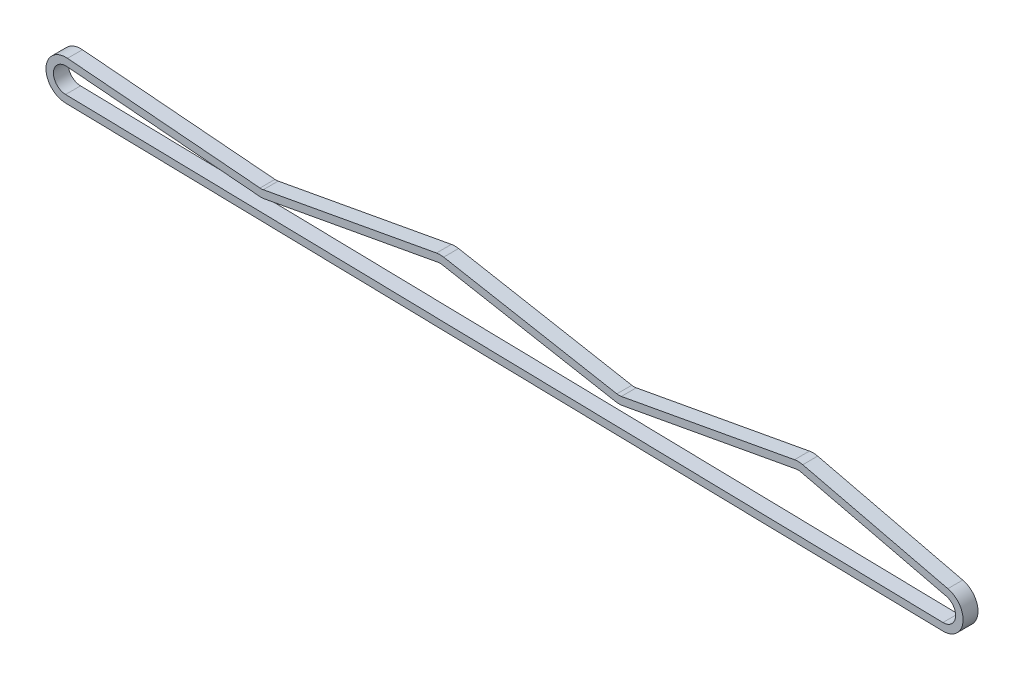
ISO-10303-21;
HEADER;
FILE_DESCRIPTION(('STEP AP214'),'2;1');
FILE_NAME('part.step','',(''),(''),'','','');
FILE_SCHEMA(('AUTOMOTIVE_DESIGN { 1 0 10303 214 1 1 1 1 }'));
ENDSEC;
DATA;
#1=APPLICATION_CONTEXT('core data for automotive mechanical design processes');
#2=APPLICATION_PROTOCOL_DEFINITION('international standard','automotive_design',2000,#1);
#3=PRODUCT_CONTEXT('',#1,'mechanical');
#4=PRODUCT('Part','Part','',(#3));
#5=PRODUCT_RELATED_PRODUCT_CATEGORY('part','',(#4));
#6=PRODUCT_DEFINITION_FORMATION('','',#4);
#7=PRODUCT_DEFINITION_CONTEXT('part definition',#1,'design');
#8=PRODUCT_DEFINITION('design','',#6,#7);
#9=PRODUCT_DEFINITION_SHAPE('','',#8);
#10=(LENGTH_UNIT() NAMED_UNIT(*) SI_UNIT(.MILLI.,.METRE.));
#11=(NAMED_UNIT(*) PLANE_ANGLE_UNIT() SI_UNIT($,.RADIAN.));
#12=(NAMED_UNIT(*) SI_UNIT($,.STERADIAN.) SOLID_ANGLE_UNIT());
#13=UNCERTAINTY_MEASURE_WITH_UNIT(LENGTH_MEASURE(1.E-05),#10,'distance_accuracy_value','');
#14=(GEOMETRIC_REPRESENTATION_CONTEXT(3) GLOBAL_UNCERTAINTY_ASSIGNED_CONTEXT((#13)) GLOBAL_UNIT_ASSIGNED_CONTEXT((#10,
#11,#12)) REPRESENTATION_CONTEXT('',''));
#15=CARTESIAN_POINT('',(0.,0.,0.));
#16=DIRECTION('',(0.,0.,1.));
#17=DIRECTION('',(1.,0.,0.));
#18=AXIS2_PLACEMENT_3D('',#15,#16,#17);
#19=CARTESIAN_POINT('',(157.37190429163,-5.00000000000004,3.));
#20=DIRECTION('',(0.,0.,-1.));
#21=DIRECTION('',(-1.,0.,0.));
#22=AXIS2_PLACEMENT_3D('',#19,#20,#21);
#23=PLANE('',#22);
#24=CARTESIAN_POINT('',(157.37190429163,-5.00000000000004,3.));
#25=DIRECTION('',(0.,0.,1.));
#26=DIRECTION('',(-1.,0.,0.));
#27=AXIS2_PLACEMENT_3D('',#24,#25,#26);
#28=CIRCLE('',#27,8.00000000000001);
#29=CARTESIAN_POINT('',(157.201895781407,-12.9981933651577,3.));
#30=VERTEX_POINT('',#29);
#31=CARTESIAN_POINT('',(159.238570958296,2.77917447776788,3.));
#32=VERTEX_POINT('',#31);
#33=EDGE_CURVE('E291',#30,#32,#28,.T.);
#34=ORIENTED_EDGE('',*,*,#33,.T.);
#35=DIRECTION('',(-0.972396809720988,0.233333333333333,0.));
#36=VECTOR('',#35,1.);
#37=CARTESIAN_POINT('',(100.894762375037,16.7791744777679,3.));
#38=LINE('',#37,#36);
#39=CARTESIAN_POINT('',(100.894762375037,16.7791744777679,3.));
#40=VERTEX_POINT('',#39);
#41=EDGE_CURVE('E294',#32,#40,#38,.T.);
#42=ORIENTED_EDGE('',*,*,#41,.T.);
#43=CARTESIAN_POINT('',(99.0280957083704,8.99999999999997,3.));
#44=DIRECTION('',(0.,0.,1.));
#45=DIRECTION('',(-1.,0.,0.));
#46=AXIS2_PLACEMENT_3D('',#43,#44,#45);
#47=CIRCLE('',#46,8.00000000000001);
#48=CARTESIAN_POINT('',(97.583651263926,16.8685183006023,3.));
#49=VERTEX_POINT('',#48);
#50=EDGE_CURVE('E297',#40,#49,#47,.T.);
#51=ORIENTED_EDGE('',*,*,#50,.T.);
#52=DIRECTION('',(-0.98356478757529,-0.180555555555555,0.));
#53=VECTOR('',#52,1.);
#54=CARTESIAN_POINT('',(27.930873486149,4.08217606212373,3.));
#55=LINE('',#54,#53);
#56=CARTESIAN_POINT('',(27.930873486149,4.08217606212373,3.));
#57=VERTEX_POINT('',#56);
#58=EDGE_CURVE('E299',#49,#57,#55,.T.);
#59=ORIENTED_EDGE('',*,*,#58,.T.);
#60=CARTESIAN_POINT('',(27.0280957083703,9.00000000000001,3.));
#61=DIRECTION('',(0.,0.,-1.));
#62=DIRECTION('',(1.,0.,0.));
#63=AXIS2_PLACEMENT_3D('',#60,#61,#62);
#64=CIRCLE('',#63,5.);
#65=CARTESIAN_POINT('',(26.1253179305915,4.08217606212374,3.));
#66=VERTEX_POINT('',#65);
#67=EDGE_CURVE('E301',#57,#66,#64,.T.);
#68=ORIENTED_EDGE('',*,*,#67,.T.);
#69=DIRECTION('',(-0.98356478757529,0.180555555555555,0.));
#70=VECTOR('',#69,1.);
#71=CARTESIAN_POINT('',(-43.5274598471853,16.8685183006023,3.));
#72=LINE('',#71,#70);
#73=CARTESIAN_POINT('',(-43.5274598471853,16.8685183006023,3.));
#74=VERTEX_POINT('',#73);
#75=EDGE_CURVE('E303',#66,#74,#72,.T.);
#76=ORIENTED_EDGE('',*,*,#75,.T.);
#77=CARTESIAN_POINT('',(-44.9719042916297,8.99999999999997,3.));
#78=DIRECTION('',(0.,0.,1.));
#79=DIRECTION('',(-1.,0.,0.));
#80=AXIS2_PLACEMENT_3D('',#77,#78,#79);
#81=CIRCLE('',#80,8.00000000000001);
#82=CARTESIAN_POINT('',(-46.4163487360742,16.8685183006023,3.));
#83=VERTEX_POINT('',#82);
#84=EDGE_CURVE('E305',#74,#83,#81,.T.);
#85=ORIENTED_EDGE('',*,*,#84,.T.);
#86=DIRECTION('',(-0.983564787575294,-0.180555555555535,0.));
#87=VECTOR('',#86,1.);
#88=CARTESIAN_POINT('',(-116.069126513851,4.0821760621252,3.));
#89=LINE('',#88,#87);
#90=CARTESIAN_POINT('',(-116.069126513851,4.0821760621252,3.));
#91=VERTEX_POINT('',#90);
#92=EDGE_CURVE('E307',#83,#91,#89,.T.);
#93=ORIENTED_EDGE('',*,*,#92,.T.);
#94=CARTESIAN_POINT('',(-116.97190429163,9.0000000000015,3.));
#95=DIRECTION('',(0.,0.,-1.));
#96=DIRECTION('',(1.,0.,0.));
#97=AXIS2_PLACEMENT_3D('',#94,#95,#96);
#98=CIRCLE('',#97,5.);
#99=CARTESIAN_POINT('',(-117.387348627879,4.01728929161408,3.));
#100=VERTEX_POINT('',#99);
#101=EDGE_CURVE('E309',#91,#100,#98,.T.);
#102=ORIENTED_EDGE('',*,*,#101,.T.);
#103=DIRECTION('',(-0.996542141677499,0.083088867249614,0.));
#104=VECTOR('',#103,1.);
#105=CARTESIAN_POINT('',(-194.807193353633,10.4723371334199,3.));
#106=LINE('',#105,#104);
#107=CARTESIAN_POINT('',(-194.807193353633,10.4723371334199,3.));
#108=VERTEX_POINT('',#107);
#109=EDGE_CURVE('E311',#100,#108,#106,.T.);
#110=ORIENTED_EDGE('',*,*,#109,.T.);
#111=CARTESIAN_POINT('',(-195.47190429163,2.49999999999992,3.));
#112=DIRECTION('',(0.,0.,1.));
#113=DIRECTION('',(1.,0.,0.));
#114=AXIS2_PLACEMENT_3D('',#111,#112,#113);
#115=CIRCLE('',#114,8.00000000000001);
#116=CARTESIAN_POINT('',(-195.641912801853,-5.49819336515773,3.));
#117=VERTEX_POINT('',#116);
#118=EDGE_CURVE('E313',#108,#117,#115,.T.);
#119=ORIENTED_EDGE('',*,*,#118,.T.);
#120=DIRECTION('',(0.999774170644705,-0.0212510637778866,0.));
#121=VECTOR('',#120,1.);
#122=CARTESIAN_POINT('',(157.201895781407,-12.9981933651577,3.));
#123=LINE('',#122,#121);
#124=EDGE_CURVE('E315',#117,#30,#123,.T.);
#125=ORIENTED_EDGE('',*,*,#124,.T.);
#126=EDGE_LOOP('',(#34,#42,#51,#59,#68,#76,#85,#93,#102,#110,#119,#125));
#127=FACE_BOUND('',#126,.T.);
#128=CARTESIAN_POINT('',(-195.47190429163,2.49999999999992,3.));
#129=DIRECTION('',(0.,0.,1.));
#130=DIRECTION('',(1.,0.,0.));
#131=AXIS2_PLACEMENT_3D('',#128,#129,#130);
#132=CIRCLE('',#131,5.00000000000001);
#133=CARTESIAN_POINT('',(-195.056459955382,7.48271070838742,3.));
#134=VERTEX_POINT('',#133);
#135=CARTESIAN_POINT('',(-195.578159610519,-2.49887085322361,3.));
#136=VERTEX_POINT('',#135);
#137=EDGE_CURVE('E198',#134,#136,#132,.T.);
#138=ORIENTED_EDGE('',*,*,#137,.F.);
#139=DIRECTION('',(-0.996542141677499,0.083088867249614,0.));
#140=VECTOR('',#139,1.);
#141=CARTESIAN_POINT('',(-195.056459955382,7.48271070838742,3.));
#142=LINE('',#141,#140);
#143=CARTESIAN_POINT('',(-117.636615229628,1.02766286658163,3.));
#144=VERTEX_POINT('',#143);
#145=EDGE_CURVE('E239',#144,#134,#142,.T.);
#146=ORIENTED_EDGE('',*,*,#145,.F.);
#147=CARTESIAN_POINT('',(-116.97190429163,9.00000000000004,3.));
#148=DIRECTION('',(0.,0.,-1.));
#149=DIRECTION('',(1.,0.,0.));
#150=AXIS2_PLACEMENT_3D('',#147,#148,#149);
#151=CIRCLE('',#150,7.99999999999856);
#152=CARTESIAN_POINT('',(-115.527459847184,1.13148169939943,3.));
#153=VERTEX_POINT('',#152);
#154=EDGE_CURVE('E237',#153,#144,#151,.T.);
#155=ORIENTED_EDGE('',*,*,#154,.F.);
#156=DIRECTION('',(-0.983564787575293,-0.180555555555535,0.));
#157=VECTOR('',#156,1.);
#158=CARTESIAN_POINT('',(-115.527459847184,1.13148169939942,3.));
#159=LINE('',#158,#157);
#160=CARTESIAN_POINT('',(-45.8746820694075,13.9178239378764,3.));
#161=VERTEX_POINT('',#160);
#162=EDGE_CURVE('E235',#161,#153,#159,.T.);
#163=ORIENTED_EDGE('',*,*,#162,.F.);
#164=CARTESIAN_POINT('',(-44.9719042916297,8.99999999999997,3.));
#165=DIRECTION('',(0.,0.,1.));
#166=DIRECTION('',(-1.,0.,0.));
#167=AXIS2_PLACEMENT_3D('',#164,#165,#166);
#168=CIRCLE('',#167,5.);
#169=CARTESIAN_POINT('',(-44.0691265138519,13.9178239378764,3.));
#170=VERTEX_POINT('',#169);
#171=EDGE_CURVE('E233',#170,#161,#168,.T.);
#172=ORIENTED_EDGE('',*,*,#171,.F.);
#173=DIRECTION('',(-0.98356478757529,0.180555555555555,0.));
#174=VECTOR('',#173,1.);
#175=CARTESIAN_POINT('',(-44.0691265138519,13.9178239378764,3.));
#176=LINE('',#175,#174);
#177=CARTESIAN_POINT('',(25.5836512639243,1.13148169939796,3.));
#178=VERTEX_POINT('',#177);
#179=EDGE_CURVE('E231',#178,#170,#176,.T.);
#180=ORIENTED_EDGE('',*,*,#179,.F.);
#181=CARTESIAN_POINT('',(27.0280957083702,9.00000000000001,3.));
#182=DIRECTION('',(0.,0.,-1.));
#183=DIRECTION('',(1.,0.,0.));
#184=AXIS2_PLACEMENT_3D('',#181,#182,#183);
#185=CIRCLE('',#184,8.);
#186=CARTESIAN_POINT('',(28.4725401528162,1.13148169939797,3.));
#187=VERTEX_POINT('',#186);
#188=EDGE_CURVE('E229',#187,#178,#185,.T.);
#189=ORIENTED_EDGE('',*,*,#188,.F.);
#190=DIRECTION('',(-0.98356478757529,-0.180555555555555,0.));
#191=VECTOR('',#190,1.);
#192=CARTESIAN_POINT('',(28.4725401528162,1.13148169939797,3.));
#193=LINE('',#192,#191);
#194=CARTESIAN_POINT('',(98.1253179305927,13.9178239378764,3.));
#195=VERTEX_POINT('',#194);
#196=EDGE_CURVE('E227',#195,#187,#193,.T.);
#197=ORIENTED_EDGE('',*,*,#196,.F.);
#198=CARTESIAN_POINT('',(99.0280957083704,8.99999999999997,3.));
#199=DIRECTION('',(0.,0.,1.));
#200=DIRECTION('',(-1.,0.,0.));
#201=AXIS2_PLACEMENT_3D('',#198,#199,#200);
#202=CIRCLE('',#201,5.);
#203=CARTESIAN_POINT('',(100.194762375037,13.8619840486049,3.));
#204=VERTEX_POINT('',#203);
#205=EDGE_CURVE('E225',#204,#195,#202,.T.);
#206=ORIENTED_EDGE('',*,*,#205,.F.);
#207=DIRECTION('',(-0.972396809720988,0.233333333333333,0.));
#208=VECTOR('',#207,1.);
#209=CARTESIAN_POINT('',(100.194762375037,13.8619840486049,3.));
#210=LINE('',#209,#208);
#211=CARTESIAN_POINT('',(158.538570958296,-0.138015951395092,3.));
#212=VERTEX_POINT('',#211);
#213=EDGE_CURVE('E221',#212,#204,#210,.T.);
#214=ORIENTED_EDGE('',*,*,#213,.F.);
#215=CARTESIAN_POINT('',(157.37190429163,-5.00000000000004,3.));
#216=DIRECTION('',(0.,0.,1.));
#217=DIRECTION('',(-1.,0.,0.));
#218=AXIS2_PLACEMENT_3D('',#215,#216,#217);
#219=CIRCLE('',#218,5.);
#220=CARTESIAN_POINT('',(157.26564897274,-9.99887085322356,3.));
#221=VERTEX_POINT('',#220);
#222=EDGE_CURVE('E219',#221,#212,#219,.T.);
#223=ORIENTED_EDGE('',*,*,#222,.F.);
#224=DIRECTION('',(0.999774170644705,-0.0212510637778866,0.));
#225=VECTOR('',#224,1.);
#226=CARTESIAN_POINT('',(157.26564897274,-9.99887085322356,3.));
#227=LINE('',#226,#225);
#228=EDGE_CURVE('E206',#136,#221,#227,.T.);
#229=ORIENTED_EDGE('',*,*,#228,.F.);
#230=EDGE_LOOP('',(#138,#146,#155,#163,#172,#180,#189,#197,#206,#214,#223,#229));
#231=FACE_BOUND('',#230,.T.);
#232=ADVANCED_FACE('F37',(#127,#231),#23,.F.);
#233=CARTESIAN_POINT('',(157.37190429163,-5.00000000000004,-3.));
#234=DIRECTION('',(0.,0.,-1.));
#235=DIRECTION('',(-1.,0.,0.));
#236=AXIS2_PLACEMENT_3D('',#233,#234,#235);
#237=PLANE('',#236);
#238=CARTESIAN_POINT('',(157.37190429163,-5.00000000000004,-3.));
#239=DIRECTION('',(0.,0.,1.));
#240=DIRECTION('',(-1.,0.,0.));
#241=AXIS2_PLACEMENT_3D('',#238,#239,#240);
#242=CIRCLE('',#241,8.00000000000001);
#243=CARTESIAN_POINT('',(157.201895781407,-12.9981933651577,-3.));
#244=VERTEX_POINT('',#243);
#245=CARTESIAN_POINT('',(159.238570958296,2.77917447776788,-3.));
#246=VERTEX_POINT('',#245);
#247=EDGE_CURVE('E214',#244,#246,#242,.T.);
#248=ORIENTED_EDGE('',*,*,#247,.F.);
#249=DIRECTION('',(0.999774170644705,-0.0212510637778866,0.));
#250=VECTOR('',#249,1.);
#251=CARTESIAN_POINT('',(157.201895781407,-12.9981933651577,-3.));
#252=LINE('',#251,#250);
#253=CARTESIAN_POINT('',(-195.641912801853,-5.49819336515773,-3.));
#254=VERTEX_POINT('',#253);
#255=EDGE_CURVE('E295',#254,#244,#252,.T.);
#256=ORIENTED_EDGE('',*,*,#255,.F.);
#257=CARTESIAN_POINT('',(-195.47190429163,2.49999999999992,-3.));
#258=DIRECTION('',(0.,0.,1.));
#259=DIRECTION('',(1.,0.,0.));
#260=AXIS2_PLACEMENT_3D('',#257,#258,#259);
#261=CIRCLE('',#260,8.00000000000001);
#262=CARTESIAN_POINT('',(-194.807193353633,10.4723371334199,-3.));
#263=VERTEX_POINT('',#262);
#264=EDGE_CURVE('E338',#263,#254,#261,.T.);
#265=ORIENTED_EDGE('',*,*,#264,.F.);
#266=DIRECTION('',(-0.996542141677499,0.083088867249614,0.));
#267=VECTOR('',#266,1.);
#268=CARTESIAN_POINT('',(-194.807193353633,10.4723371334199,-3.));
#269=LINE('',#268,#267);
#270=CARTESIAN_POINT('',(-117.387348627879,4.01728929161408,-3.));
#271=VERTEX_POINT('',#270);
#272=EDGE_CURVE('E336',#271,#263,#269,.T.);
#273=ORIENTED_EDGE('',*,*,#272,.F.);
#274=CARTESIAN_POINT('',(-116.97190429163,9.0000000000015,-3.));
#275=DIRECTION('',(0.,0.,-1.));
#276=DIRECTION('',(1.,0.,0.));
#277=AXIS2_PLACEMENT_3D('',#274,#275,#276);
#278=CIRCLE('',#277,5.);
#279=CARTESIAN_POINT('',(-116.069126513851,4.0821760621252,-3.));
#280=VERTEX_POINT('',#279);
#281=EDGE_CURVE('E334',#280,#271,#278,.T.);
#282=ORIENTED_EDGE('',*,*,#281,.F.);
#283=DIRECTION('',(-0.983564787575294,-0.180555555555535,0.));
#284=VECTOR('',#283,1.);
#285=CARTESIAN_POINT('',(-116.069126513851,4.0821760621252,-3.));
#286=LINE('',#285,#284);
#287=CARTESIAN_POINT('',(-46.4163487360742,16.8685183006023,-3.));
#288=VERTEX_POINT('',#287);
#289=EDGE_CURVE('E332',#288,#280,#286,.T.);
#290=ORIENTED_EDGE('',*,*,#289,.F.);
#291=CARTESIAN_POINT('',(-44.9719042916297,8.99999999999997,-3.));
#292=DIRECTION('',(0.,0.,1.));
#293=DIRECTION('',(-1.,0.,0.));
#294=AXIS2_PLACEMENT_3D('',#291,#292,#293);
#295=CIRCLE('',#294,8.00000000000001);
#296=CARTESIAN_POINT('',(-43.5274598471853,16.8685183006023,-3.));
#297=VERTEX_POINT('',#296);
#298=EDGE_CURVE('E330',#297,#288,#295,.T.);
#299=ORIENTED_EDGE('',*,*,#298,.F.);
#300=DIRECTION('',(-0.98356478757529,0.180555555555555,0.));
#301=VECTOR('',#300,1.);
#302=CARTESIAN_POINT('',(-43.5274598471853,16.8685183006023,-3.));
#303=LINE('',#302,#301);
#304=CARTESIAN_POINT('',(26.1253179305915,4.08217606212374,-3.));
#305=VERTEX_POINT('',#304);
#306=EDGE_CURVE('E328',#305,#297,#303,.T.);
#307=ORIENTED_EDGE('',*,*,#306,.F.);
#308=CARTESIAN_POINT('',(27.0280957083703,9.00000000000001,-3.));
#309=DIRECTION('',(0.,0.,-1.));
#310=DIRECTION('',(1.,0.,0.));
#311=AXIS2_PLACEMENT_3D('',#308,#309,#310);
#312=CIRCLE('',#311,5.);
#313=CARTESIAN_POINT('',(27.930873486149,4.08217606212373,-3.));
#314=VERTEX_POINT('',#313);
#315=EDGE_CURVE('E326',#314,#305,#312,.T.);
#316=ORIENTED_EDGE('',*,*,#315,.F.);
#317=DIRECTION('',(-0.98356478757529,-0.180555555555555,0.));
#318=VECTOR('',#317,1.);
#319=CARTESIAN_POINT('',(27.930873486149,4.08217606212373,-3.));
#320=LINE('',#319,#318);
#321=CARTESIAN_POINT('',(97.583651263926,16.8685183006023,-3.));
#322=VERTEX_POINT('',#321);
#323=EDGE_CURVE('E324',#322,#314,#320,.T.);
#324=ORIENTED_EDGE('',*,*,#323,.F.);
#325=CARTESIAN_POINT('',(99.0280957083704,8.99999999999997,-3.));
#326=DIRECTION('',(0.,0.,1.));
#327=DIRECTION('',(-1.,0.,0.));
#328=AXIS2_PLACEMENT_3D('',#325,#326,#327);
#329=CIRCLE('',#328,8.00000000000001);
#330=CARTESIAN_POINT('',(100.894762375037,16.7791744777679,-3.));
#331=VERTEX_POINT('',#330);
#332=EDGE_CURVE('E322',#331,#322,#329,.T.);
#333=ORIENTED_EDGE('',*,*,#332,.F.);
#334=DIRECTION('',(-0.972396809720988,0.233333333333333,0.));
#335=VECTOR('',#334,1.);
#336=CARTESIAN_POINT('',(100.894762375037,16.7791744777679,-3.));
#337=LINE('',#336,#335);
#338=EDGE_CURVE('E320',#246,#331,#337,.T.);
#339=ORIENTED_EDGE('',*,*,#338,.F.);
#340=EDGE_LOOP('',(#248,#256,#265,#273,#282,#290,#299,#307,#316,#324,#333,#339));
#341=FACE_BOUND('',#340,.T.);
#342=DIRECTION('',(-0.996542141677499,0.083088867249614,0.));
#343=VECTOR('',#342,1.);
#344=CARTESIAN_POINT('',(-195.056459955382,7.48271070838742,-3.));
#345=LINE('',#344,#343);
#346=CARTESIAN_POINT('',(-117.636615229628,1.02766286658162,-3.));
#347=VERTEX_POINT('',#346);
#348=CARTESIAN_POINT('',(-195.056459955382,7.48271070838742,-3.));
#349=VERTEX_POINT('',#348);
#350=EDGE_CURVE('E207',#347,#349,#345,.T.);
#351=ORIENTED_EDGE('',*,*,#350,.T.);
#352=CARTESIAN_POINT('',(-195.47190429163,2.49999999999992,-3.));
#353=DIRECTION('',(0.,0.,1.));
#354=DIRECTION('',(1.,0.,0.));
#355=AXIS2_PLACEMENT_3D('',#352,#353,#354);
#356=CIRCLE('',#355,5.00000000000001);
#357=CARTESIAN_POINT('',(-195.578159610519,-2.49887085322361,-3.));
#358=VERTEX_POINT('',#357);
#359=EDGE_CURVE('E60',#349,#358,#356,.T.);
#360=ORIENTED_EDGE('',*,*,#359,.T.);
#361=DIRECTION('',(0.999774170644705,-0.0212510637778866,0.));
#362=VECTOR('',#361,1.);
#363=CARTESIAN_POINT('',(157.26564897274,-9.99887085322356,-3.));
#364=LINE('',#363,#362);
#365=CARTESIAN_POINT('',(157.26564897274,-9.99887085322356,-3.));
#366=VERTEX_POINT('',#365);
#367=EDGE_CURVE('E213',#358,#366,#364,.T.);
#368=ORIENTED_EDGE('',*,*,#367,.T.);
#369=CARTESIAN_POINT('',(157.37190429163,-5.00000000000004,-3.));
#370=DIRECTION('',(0.,0.,1.));
#371=DIRECTION('',(-1.,0.,0.));
#372=AXIS2_PLACEMENT_3D('',#369,#370,#371);
#373=CIRCLE('',#372,5.);
#374=CARTESIAN_POINT('',(158.538570958296,-0.138015951395092,-3.));
#375=VERTEX_POINT('',#374);
#376=EDGE_CURVE('E243',#366,#375,#373,.T.);
#377=ORIENTED_EDGE('',*,*,#376,.T.);
#378=DIRECTION('',(-0.972396809720988,0.233333333333333,0.));
#379=VECTOR('',#378,1.);
#380=CARTESIAN_POINT('',(100.194762375037,13.8619840486049,-3.));
#381=LINE('',#380,#379);
#382=CARTESIAN_POINT('',(100.194762375037,13.8619840486049,-3.));
#383=VERTEX_POINT('',#382);
#384=EDGE_CURVE('E246',#375,#383,#381,.T.);
#385=ORIENTED_EDGE('',*,*,#384,.T.);
#386=CARTESIAN_POINT('',(99.0280957083704,8.99999999999997,-3.));
#387=DIRECTION('',(0.,0.,1.));
#388=DIRECTION('',(-1.,0.,0.));
#389=AXIS2_PLACEMENT_3D('',#386,#387,#388);
#390=CIRCLE('',#389,5.);
#391=CARTESIAN_POINT('',(98.1253179305927,13.9178239378764,-3.));
#392=VERTEX_POINT('',#391);
#393=EDGE_CURVE('E249',#383,#392,#390,.T.);
#394=ORIENTED_EDGE('',*,*,#393,.T.);
#395=DIRECTION('',(-0.98356478757529,-0.180555555555555,0.));
#396=VECTOR('',#395,1.);
#397=CARTESIAN_POINT('',(28.4725401528162,1.13148169939797,-3.));
#398=LINE('',#397,#396);
#399=CARTESIAN_POINT('',(28.4725401528162,1.13148169939797,-3.));
#400=VERTEX_POINT('',#399);
#401=EDGE_CURVE('E252',#392,#400,#398,.T.);
#402=ORIENTED_EDGE('',*,*,#401,.T.);
#403=CARTESIAN_POINT('',(27.0280957083702,9.00000000000001,-3.));
#404=DIRECTION('',(0.,0.,-1.));
#405=DIRECTION('',(1.,0.,0.));
#406=AXIS2_PLACEMENT_3D('',#403,#404,#405);
#407=CIRCLE('',#406,8.);
#408=CARTESIAN_POINT('',(25.5836512639243,1.13148169939796,-3.));
#409=VERTEX_POINT('',#408);
#410=EDGE_CURVE('E255',#400,#409,#407,.T.);
#411=ORIENTED_EDGE('',*,*,#410,.T.);
#412=DIRECTION('',(-0.98356478757529,0.180555555555555,0.));
#413=VECTOR('',#412,1.);
#414=CARTESIAN_POINT('',(-44.0691265138519,13.9178239378764,-3.));
#415=LINE('',#414,#413);
#416=CARTESIAN_POINT('',(-44.0691265138519,13.9178239378764,-3.));
#417=VERTEX_POINT('',#416);
#418=EDGE_CURVE('E258',#409,#417,#415,.T.);
#419=ORIENTED_EDGE('',*,*,#418,.T.);
#420=CARTESIAN_POINT('',(-44.9719042916297,8.99999999999997,-3.));
#421=DIRECTION('',(0.,0.,1.));
#422=DIRECTION('',(-1.,0.,0.));
#423=AXIS2_PLACEMENT_3D('',#420,#421,#422);
#424=CIRCLE('',#423,5.);
#425=CARTESIAN_POINT('',(-45.8746820694075,13.9178239378764,-3.));
#426=VERTEX_POINT('',#425);
#427=EDGE_CURVE('E261',#417,#426,#424,.T.);
#428=ORIENTED_EDGE('',*,*,#427,.T.);
#429=DIRECTION('',(-0.983564787575293,-0.180555555555535,0.));
#430=VECTOR('',#429,1.);
#431=CARTESIAN_POINT('',(-115.527459847184,1.13148169939942,-3.));
#432=LINE('',#431,#430);
#433=CARTESIAN_POINT('',(-115.527459847184,1.13148169939943,-3.));
#434=VERTEX_POINT('',#433);
#435=EDGE_CURVE('E264',#426,#434,#432,.T.);
#436=ORIENTED_EDGE('',*,*,#435,.T.);
#437=CARTESIAN_POINT('',(-116.97190429163,9.00000000000004,-3.));
#438=DIRECTION('',(0.,0.,-1.));
#439=DIRECTION('',(1.,0.,0.));
#440=AXIS2_PLACEMENT_3D('',#437,#438,#439);
#441=CIRCLE('',#440,7.99999999999856);
#442=EDGE_CURVE('E267',#434,#347,#441,.T.);
#443=ORIENTED_EDGE('',*,*,#442,.T.);
#444=EDGE_LOOP('',(#351,#360,#368,#377,#385,#394,#402,#411,#419,#428,#436,#443));
#445=FACE_BOUND('',#444,.T.);
#446=ADVANCED_FACE('F380',(#341,#445),#237,.T.);
#447=CARTESIAN_POINT('',(157.37190429163,-5.00000000000004,3.));
#448=DIRECTION('',(0.,0.,-1.));
#449=DIRECTION('',(-1.,0.,0.));
#450=AXIS2_PLACEMENT_3D('',#447,#448,#449);
#451=CYLINDRICAL_SURFACE('',#450,8.00000000000001);
#452=ORIENTED_EDGE('',*,*,#247,.T.);
#453=DIRECTION('',(0.,0.,-1.));
#454=VECTOR('',#453,1.);
#455=CARTESIAN_POINT('',(159.238570958296,2.77917447776788,3.));
#456=LINE('',#455,#454);
#457=EDGE_CURVE('E11',#32,#246,#456,.T.);
#458=ORIENTED_EDGE('',*,*,#457,.F.);
#459=ORIENTED_EDGE('',*,*,#33,.F.);
#460=DIRECTION('',(0.,0.,-1.));
#461=VECTOR('',#460,1.);
#462=CARTESIAN_POINT('',(157.201895781407,-12.9981933651577,3.));
#463=LINE('',#462,#461);
#464=EDGE_CURVE('E317',#30,#244,#463,.T.);
#465=ORIENTED_EDGE('',*,*,#464,.T.);
#466=EDGE_LOOP('',(#452,#458,#459,#465));
#467=FACE_BOUND('',#466,.T.);
#468=ADVANCED_FACE('F39',(#467),#451,.T.);
#469=CARTESIAN_POINT('',(100.894762375037,16.7791744777679,3.));
#470=DIRECTION('',(-0.233333333333333,-0.972396809720988,0.));
#471=DIRECTION('',(0.972396809720988,-0.233333333333333,0.));
#472=AXIS2_PLACEMENT_3D('',#469,#470,#471);
#473=PLANE('',#472);
#474=ORIENTED_EDGE('',*,*,#338,.T.);
#475=DIRECTION('',(0.,0.,-1.));
#476=VECTOR('',#475,1.);
#477=CARTESIAN_POINT('',(100.894762375037,16.7791744777679,3.));
#478=LINE('',#477,#476);
#479=EDGE_CURVE('E45',#40,#331,#478,.T.);
#480=ORIENTED_EDGE('',*,*,#479,.F.);
#481=ORIENTED_EDGE('',*,*,#41,.F.);
#482=ORIENTED_EDGE('',*,*,#457,.T.);
#483=EDGE_LOOP('',(#474,#480,#481,#482));
#484=FACE_BOUND('',#483,.T.);
#485=ADVANCED_FACE('F397',(#484),#473,.F.);
#486=CARTESIAN_POINT('',(99.0280957083704,8.99999999999997,3.));
#487=DIRECTION('',(0.,0.,-1.));
#488=DIRECTION('',(-1.,0.,0.));
#489=AXIS2_PLACEMENT_3D('',#486,#487,#488);
#490=CYLINDRICAL_SURFACE('',#489,8.00000000000001);
#491=ORIENTED_EDGE('',*,*,#332,.T.);
#492=DIRECTION('',(0.,0.,-1.));
#493=VECTOR('',#492,1.);
#494=CARTESIAN_POINT('',(97.583651263926,16.8685183006023,3.));
#495=LINE('',#494,#493);
#496=EDGE_CURVE('E367',#49,#322,#495,.T.);
#497=ORIENTED_EDGE('',*,*,#496,.F.);
#498=ORIENTED_EDGE('',*,*,#50,.F.);
#499=ORIENTED_EDGE('',*,*,#479,.T.);
#500=EDGE_LOOP('',(#491,#497,#498,#499));
#501=FACE_BOUND('',#500,.T.);
#502=ADVANCED_FACE('F374',(#501),#490,.T.);
#503=CARTESIAN_POINT('',(27.930873486149,4.08217606212373,3.));
#504=DIRECTION('',(0.180555555555555,-0.98356478757529,0.));
#505=DIRECTION('',(0.98356478757529,0.180555555555555,0.));
#506=AXIS2_PLACEMENT_3D('',#503,#504,#505);
#507=PLANE('',#506);
#508=ORIENTED_EDGE('',*,*,#323,.T.);
#509=DIRECTION('',(0.,0.,-1.));
#510=VECTOR('',#509,1.);
#511=CARTESIAN_POINT('',(27.930873486149,4.08217606212373,3.));
#512=LINE('',#511,#510);
#513=EDGE_CURVE('E364',#57,#314,#512,.T.);
#514=ORIENTED_EDGE('',*,*,#513,.F.);
#515=ORIENTED_EDGE('',*,*,#58,.F.);
#516=ORIENTED_EDGE('',*,*,#496,.T.);
#517=EDGE_LOOP('',(#508,#514,#515,#516));
#518=FACE_BOUND('',#517,.T.);
#519=ADVANCED_FACE('F386',(#518),#507,.F.);
#520=CARTESIAN_POINT('',(27.0280957083703,9.00000000000001,3.));
#521=DIRECTION('',(0.,0.,-1.));
#522=DIRECTION('',(-1.,0.,0.));
#523=AXIS2_PLACEMENT_3D('',#520,#521,#522);
#524=CYLINDRICAL_SURFACE('',#523,5.);
#525=ORIENTED_EDGE('',*,*,#315,.T.);
#526=DIRECTION('',(0.,0.,-1.));
#527=VECTOR('',#526,1.);
#528=CARTESIAN_POINT('',(26.1253179305915,4.08217606212374,3.));
#529=LINE('',#528,#527);
#530=EDGE_CURVE('E361',#66,#305,#529,.T.);
#531=ORIENTED_EDGE('',*,*,#530,.F.);
#532=ORIENTED_EDGE('',*,*,#67,.F.);
#533=ORIENTED_EDGE('',*,*,#513,.T.);
#534=EDGE_LOOP('',(#525,#531,#532,#533));
#535=FACE_BOUND('',#534,.T.);
#536=ADVANCED_FACE('F390',(#535),#524,.F.);
#537=CARTESIAN_POINT('',(-43.5274598471853,16.8685183006023,3.));
#538=DIRECTION('',(-0.180555555555555,-0.98356478757529,0.));
#539=DIRECTION('',(0.98356478757529,-0.180555555555555,0.));
#540=AXIS2_PLACEMENT_3D('',#537,#538,#539);
#541=PLANE('',#540);
#542=ORIENTED_EDGE('',*,*,#306,.T.);
#543=DIRECTION('',(0.,0.,-1.));
#544=VECTOR('',#543,1.);
#545=CARTESIAN_POINT('',(-43.5274598471853,16.8685183006023,3.));
#546=LINE('',#545,#544);
#547=EDGE_CURVE('E358',#74,#297,#546,.T.);
#548=ORIENTED_EDGE('',*,*,#547,.F.);
#549=ORIENTED_EDGE('',*,*,#75,.F.);
#550=ORIENTED_EDGE('',*,*,#530,.T.);
#551=EDGE_LOOP('',(#542,#548,#549,#550));
#552=FACE_BOUND('',#551,.T.);
#553=ADVANCED_FACE('F430',(#552),#541,.F.);
#554=CARTESIAN_POINT('',(-44.9719042916297,8.99999999999997,3.));
#555=DIRECTION('',(0.,0.,-1.));
#556=DIRECTION('',(-1.,0.,0.));
#557=AXIS2_PLACEMENT_3D('',#554,#555,#556);
#558=CYLINDRICAL_SURFACE('',#557,8.00000000000001);
#559=ORIENTED_EDGE('',*,*,#298,.T.);
#560=DIRECTION('',(0.,0.,-1.));
#561=VECTOR('',#560,1.);
#562=CARTESIAN_POINT('',(-46.4163487360742,16.8685183006023,3.));
#563=LINE('',#562,#561);
#564=EDGE_CURVE('E355',#83,#288,#563,.T.);
#565=ORIENTED_EDGE('',*,*,#564,.F.);
#566=ORIENTED_EDGE('',*,*,#84,.F.);
#567=ORIENTED_EDGE('',*,*,#547,.T.);
#568=EDGE_LOOP('',(#559,#565,#566,#567));
#569=FACE_BOUND('',#568,.T.);
#570=ADVANCED_FACE('F428',(#569),#558,.T.);
#571=CARTESIAN_POINT('',(-116.069126513851,4.0821760621252,3.));
#572=DIRECTION('',(0.180555555555535,-0.983564787575293,0.));
#573=DIRECTION('',(0.983564787575294,0.180555555555535,0.));
#574=AXIS2_PLACEMENT_3D('',#571,#572,#573);
#575=PLANE('',#574);
#576=ORIENTED_EDGE('',*,*,#289,.T.);
#577=DIRECTION('',(0.,0.,-1.));
#578=VECTOR('',#577,1.);
#579=CARTESIAN_POINT('',(-116.069126513851,4.0821760621252,3.));
#580=LINE('',#579,#578);
#581=EDGE_CURVE('E352',#91,#280,#580,.T.);
#582=ORIENTED_EDGE('',*,*,#581,.F.);
#583=ORIENTED_EDGE('',*,*,#92,.F.);
#584=ORIENTED_EDGE('',*,*,#564,.T.);
#585=EDGE_LOOP('',(#576,#582,#583,#584));
#586=FACE_BOUND('',#585,.T.);
#587=ADVANCED_FACE('F424',(#586),#575,.F.);
#588=CARTESIAN_POINT('',(-116.97190429163,9.0000000000015,3.));
#589=DIRECTION('',(0.,0.,-1.));
#590=DIRECTION('',(-1.,0.,0.));
#591=AXIS2_PLACEMENT_3D('',#588,#589,#590);
#592=CYLINDRICAL_SURFACE('',#591,5.);
#593=ORIENTED_EDGE('',*,*,#281,.T.);
#594=DIRECTION('',(0.,0.,-1.));
#595=VECTOR('',#594,1.);
#596=CARTESIAN_POINT('',(-117.387348627879,4.01728929161408,3.));
#597=LINE('',#596,#595);
#598=EDGE_CURVE('E349',#100,#271,#597,.T.);
#599=ORIENTED_EDGE('',*,*,#598,.F.);
#600=ORIENTED_EDGE('',*,*,#101,.F.);
#601=ORIENTED_EDGE('',*,*,#581,.T.);
#602=EDGE_LOOP('',(#593,#599,#600,#601));
#603=FACE_BOUND('',#602,.T.);
#604=ADVANCED_FACE('F419',(#603),#592,.F.);
#605=CARTESIAN_POINT('',(-194.807193353633,10.4723371334199,3.));
#606=DIRECTION('',(-0.083088867249614,-0.996542141677499,0.));
#607=DIRECTION('',(0.996542141677499,-0.083088867249614,0.));
#608=AXIS2_PLACEMENT_3D('',#605,#606,#607);
#609=PLANE('',#608);
#610=ORIENTED_EDGE('',*,*,#272,.T.);
#611=DIRECTION('',(0.,0.,-1.));
#612=VECTOR('',#611,1.);
#613=CARTESIAN_POINT('',(-194.807193353633,10.4723371334199,3.));
#614=LINE('',#613,#612);
#615=EDGE_CURVE('E346',#108,#263,#614,.T.);
#616=ORIENTED_EDGE('',*,*,#615,.F.);
#617=ORIENTED_EDGE('',*,*,#109,.F.);
#618=ORIENTED_EDGE('',*,*,#598,.T.);
#619=EDGE_LOOP('',(#610,#616,#617,#618));
#620=FACE_BOUND('',#619,.T.);
#621=ADVANCED_FACE('F413',(#620),#609,.F.);
#622=CARTESIAN_POINT('',(-195.47190429163,2.49999999999992,3.));
#623=DIRECTION('',(0.,0.,-1.));
#624=DIRECTION('',(-1.,0.,0.));
#625=AXIS2_PLACEMENT_3D('',#622,#623,#624);
#626=CYLINDRICAL_SURFACE('',#625,8.00000000000001);
#627=ORIENTED_EDGE('',*,*,#264,.T.);
#628=DIRECTION('',(0.,0.,-1.));
#629=VECTOR('',#628,1.);
#630=CARTESIAN_POINT('',(-195.641912801853,-5.49819336515773,3.));
#631=LINE('',#630,#629);
#632=EDGE_CURVE('E343',#117,#254,#631,.T.);
#633=ORIENTED_EDGE('',*,*,#632,.F.);
#634=ORIENTED_EDGE('',*,*,#118,.F.);
#635=ORIENTED_EDGE('',*,*,#615,.T.);
#636=EDGE_LOOP('',(#627,#633,#634,#635));
#637=FACE_BOUND('',#636,.T.);
#638=ADVANCED_FACE('F409',(#637),#626,.T.);
#639=CARTESIAN_POINT('',(157.201895781407,-12.9981933651577,3.));
#640=DIRECTION('',(0.0212510637778866,0.999774170644705,0.));
#641=DIRECTION('',(-0.999774170644705,0.0212510637778866,0.));
#642=AXIS2_PLACEMENT_3D('',#639,#640,#641);
#643=PLANE('',#642);
#644=ORIENTED_EDGE('',*,*,#255,.T.);
#645=ORIENTED_EDGE('',*,*,#464,.F.);
#646=ORIENTED_EDGE('',*,*,#124,.F.);
#647=ORIENTED_EDGE('',*,*,#632,.T.);
#648=EDGE_LOOP('',(#644,#645,#646,#647));
#649=FACE_BOUND('',#648,.T.);
#650=ADVANCED_FACE('F404',(#649),#643,.F.);
#651=CARTESIAN_POINT('',(-195.47190429163,2.49999999999992,3.));
#652=DIRECTION('',(0.,0.,-1.));
#653=DIRECTION('',(-1.,0.,0.));
#654=AXIS2_PLACEMENT_3D('',#651,#652,#653);
#655=CYLINDRICAL_SURFACE('',#654,5.00000000000001);
#656=ORIENTED_EDGE('',*,*,#359,.F.);
#657=DIRECTION('',(0.,0.,-1.));
#658=VECTOR('',#657,1.);
#659=CARTESIAN_POINT('',(-195.056459955382,7.48271070838742,3.));
#660=LINE('',#659,#658);
#661=EDGE_CURVE('E202',#134,#349,#660,.T.);
#662=ORIENTED_EDGE('',*,*,#661,.F.);
#663=ORIENTED_EDGE('',*,*,#137,.T.);
#664=DIRECTION('',(0.,0.,-1.));
#665=VECTOR('',#664,1.);
#666=CARTESIAN_POINT('',(-195.578159610519,-2.49887085322361,3.));
#667=LINE('',#666,#665);
#668=EDGE_CURVE('E201',#136,#358,#667,.T.);
#669=ORIENTED_EDGE('',*,*,#668,.T.);
#670=EDGE_LOOP('',(#656,#662,#663,#669));
#671=FACE_BOUND('',#670,.T.);
#672=ADVANCED_FACE('F200',(#671),#655,.F.);
#673=CARTESIAN_POINT('',(157.26564897274,-9.99887085322356,3.));
#674=DIRECTION('',(0.0212510637778865,0.999774170644705,0.));
#675=DIRECTION('',(-0.999774170644705,0.0212510637778866,0.));
#676=AXIS2_PLACEMENT_3D('',#673,#674,#675);
#677=PLANE('',#676);
#678=ORIENTED_EDGE('',*,*,#367,.F.);
#679=ORIENTED_EDGE('',*,*,#668,.F.);
#680=ORIENTED_EDGE('',*,*,#228,.T.);
#681=DIRECTION('',(0.,0.,-1.));
#682=VECTOR('',#681,1.);
#683=CARTESIAN_POINT('',(157.26564897274,-9.99887085322356,3.));
#684=LINE('',#683,#682);
#685=EDGE_CURVE('E215',#221,#366,#684,.T.);
#686=ORIENTED_EDGE('',*,*,#685,.T.);
#687=EDGE_LOOP('',(#678,#679,#680,#686));
#688=FACE_BOUND('',#687,.T.);
#689=ADVANCED_FACE('F210',(#688),#677,.T.);
#690=CARTESIAN_POINT('',(157.37190429163,-5.00000000000004,3.));
#691=DIRECTION('',(0.,0.,-1.));
#692=DIRECTION('',(-1.,0.,0.));
#693=AXIS2_PLACEMENT_3D('',#690,#691,#692);
#694=CYLINDRICAL_SURFACE('',#693,5.);
#695=ORIENTED_EDGE('',*,*,#376,.F.);
#696=ORIENTED_EDGE('',*,*,#685,.F.);
#697=ORIENTED_EDGE('',*,*,#222,.T.);
#698=DIRECTION('',(0.,0.,-1.));
#699=VECTOR('',#698,1.);
#700=CARTESIAN_POINT('',(158.538570958296,-0.138015951395092,3.));
#701=LINE('',#700,#699);
#702=EDGE_CURVE('E288',#212,#375,#701,.T.);
#703=ORIENTED_EDGE('',*,*,#702,.T.);
#704=EDGE_LOOP('',(#695,#696,#697,#703));
#705=FACE_BOUND('',#704,.T.);
#706=ADVANCED_FACE('F488',(#705),#694,.F.);
#707=CARTESIAN_POINT('',(100.194762375037,13.8619840486049,3.));
#708=DIRECTION('',(-0.233333333333333,-0.972396809720988,0.));
#709=DIRECTION('',(0.972396809720988,-0.233333333333333,0.));
#710=AXIS2_PLACEMENT_3D('',#707,#708,#709);
#711=PLANE('',#710);
#712=ORIENTED_EDGE('',*,*,#384,.F.);
#713=ORIENTED_EDGE('',*,*,#702,.F.);
#714=ORIENTED_EDGE('',*,*,#213,.T.);
#715=DIRECTION('',(0.,0.,-1.));
#716=VECTOR('',#715,1.);
#717=CARTESIAN_POINT('',(100.194762375037,13.8619840486049,3.));
#718=LINE('',#717,#716);
#719=EDGE_CURVE('E286',#204,#383,#718,.T.);
#720=ORIENTED_EDGE('',*,*,#719,.T.);
#721=EDGE_LOOP('',(#712,#713,#714,#720));
#722=FACE_BOUND('',#721,.T.);
#723=ADVANCED_FACE('F494',(#722),#711,.T.);
#724=CARTESIAN_POINT('',(99.0280957083704,8.99999999999997,3.));
#725=DIRECTION('',(0.,0.,-1.));
#726=DIRECTION('',(-1.,0.,0.));
#727=AXIS2_PLACEMENT_3D('',#724,#725,#726);
#728=CYLINDRICAL_SURFACE('',#727,5.);
#729=ORIENTED_EDGE('',*,*,#393,.F.);
#730=ORIENTED_EDGE('',*,*,#719,.F.);
#731=ORIENTED_EDGE('',*,*,#205,.T.);
#732=DIRECTION('',(0.,0.,-1.));
#733=VECTOR('',#732,1.);
#734=CARTESIAN_POINT('',(98.1253179305927,13.9178239378764,3.));
#735=LINE('',#734,#733);
#736=EDGE_CURVE('E284',#195,#392,#735,.T.);
#737=ORIENTED_EDGE('',*,*,#736,.T.);
#738=EDGE_LOOP('',(#729,#730,#731,#737));
#739=FACE_BOUND('',#738,.T.);
#740=ADVANCED_FACE('F502',(#739),#728,.F.);
#741=CARTESIAN_POINT('',(28.4725401528162,1.13148169939797,3.));
#742=DIRECTION('',(0.180555555555555,-0.98356478757529,0.));
#743=DIRECTION('',(0.98356478757529,0.180555555555555,0.));
#744=AXIS2_PLACEMENT_3D('',#741,#742,#743);
#745=PLANE('',#744);
#746=ORIENTED_EDGE('',*,*,#401,.F.);
#747=ORIENTED_EDGE('',*,*,#736,.F.);
#748=ORIENTED_EDGE('',*,*,#196,.T.);
#749=DIRECTION('',(0.,0.,-1.));
#750=VECTOR('',#749,1.);
#751=CARTESIAN_POINT('',(28.4725401528162,1.13148169939797,3.));
#752=LINE('',#751,#750);
#753=EDGE_CURVE('E282',#187,#400,#752,.T.);
#754=ORIENTED_EDGE('',*,*,#753,.T.);
#755=EDGE_LOOP('',(#746,#747,#748,#754));
#756=FACE_BOUND('',#755,.T.);
#757=ADVANCED_FACE('F510',(#756),#745,.T.);
#758=CARTESIAN_POINT('',(27.0280957083702,9.00000000000001,3.));
#759=DIRECTION('',(0.,0.,-1.));
#760=DIRECTION('',(-1.,0.,0.));
#761=AXIS2_PLACEMENT_3D('',#758,#759,#760);
#762=CYLINDRICAL_SURFACE('',#761,8.);
#763=ORIENTED_EDGE('',*,*,#410,.F.);
#764=ORIENTED_EDGE('',*,*,#753,.F.);
#765=ORIENTED_EDGE('',*,*,#188,.T.);
#766=DIRECTION('',(0.,0.,-1.));
#767=VECTOR('',#766,1.);
#768=CARTESIAN_POINT('',(25.5836512639243,1.13148169939796,3.));
#769=LINE('',#768,#767);
#770=EDGE_CURVE('E280',#178,#409,#769,.T.);
#771=ORIENTED_EDGE('',*,*,#770,.T.);
#772=EDGE_LOOP('',(#763,#764,#765,#771));
#773=FACE_BOUND('',#772,.T.);
#774=ADVANCED_FACE('F518',(#773),#762,.T.);
#775=CARTESIAN_POINT('',(-44.0691265138519,13.9178239378764,3.));
#776=DIRECTION('',(-0.180555555555555,-0.98356478757529,0.));
#777=DIRECTION('',(0.98356478757529,-0.180555555555555,0.));
#778=AXIS2_PLACEMENT_3D('',#775,#776,#777);
#779=PLANE('',#778);
#780=ORIENTED_EDGE('',*,*,#418,.F.);
#781=ORIENTED_EDGE('',*,*,#770,.F.);
#782=ORIENTED_EDGE('',*,*,#179,.T.);
#783=DIRECTION('',(0.,0.,-1.));
#784=VECTOR('',#783,1.);
#785=CARTESIAN_POINT('',(-44.0691265138519,13.9178239378764,3.));
#786=LINE('',#785,#784);
#787=EDGE_CURVE('E278',#170,#417,#786,.T.);
#788=ORIENTED_EDGE('',*,*,#787,.T.);
#789=EDGE_LOOP('',(#780,#781,#782,#788));
#790=FACE_BOUND('',#789,.T.);
#791=ADVANCED_FACE('F526',(#790),#779,.T.);
#792=CARTESIAN_POINT('',(-44.9719042916297,8.99999999999997,3.));
#793=DIRECTION('',(0.,0.,-1.));
#794=DIRECTION('',(-1.,0.,0.));
#795=AXIS2_PLACEMENT_3D('',#792,#793,#794);
#796=CYLINDRICAL_SURFACE('',#795,5.);
#797=ORIENTED_EDGE('',*,*,#427,.F.);
#798=ORIENTED_EDGE('',*,*,#787,.F.);
#799=ORIENTED_EDGE('',*,*,#171,.T.);
#800=DIRECTION('',(0.,0.,-1.));
#801=VECTOR('',#800,1.);
#802=CARTESIAN_POINT('',(-45.8746820694075,13.9178239378764,3.));
#803=LINE('',#802,#801);
#804=EDGE_CURVE('E276',#161,#426,#803,.T.);
#805=ORIENTED_EDGE('',*,*,#804,.T.);
#806=EDGE_LOOP('',(#797,#798,#799,#805));
#807=FACE_BOUND('',#806,.T.);
#808=ADVANCED_FACE('F534',(#807),#796,.F.);
#809=CARTESIAN_POINT('',(-115.527459847184,1.13148169939942,3.));
#810=DIRECTION('',(0.180555555555535,-0.983564787575294,0.));
#811=DIRECTION('',(0.983564787575294,0.180555555555535,0.));
#812=AXIS2_PLACEMENT_3D('',#809,#810,#811);
#813=PLANE('',#812);
#814=ORIENTED_EDGE('',*,*,#435,.F.);
#815=ORIENTED_EDGE('',*,*,#804,.F.);
#816=ORIENTED_EDGE('',*,*,#162,.T.);
#817=DIRECTION('',(0.,0.,-1.));
#818=VECTOR('',#817,1.);
#819=CARTESIAN_POINT('',(-115.527459847184,1.13148169939943,3.));
#820=LINE('',#819,#818);
#821=EDGE_CURVE('E274',#153,#434,#820,.T.);
#822=ORIENTED_EDGE('',*,*,#821,.T.);
#823=EDGE_LOOP('',(#814,#815,#816,#822));
#824=FACE_BOUND('',#823,.T.);
#825=ADVANCED_FACE('F542',(#824),#813,.T.);
#826=CARTESIAN_POINT('',(-116.97190429163,9.00000000000004,3.));
#827=DIRECTION('',(0.,0.,-1.));
#828=DIRECTION('',(-1.,0.,0.));
#829=AXIS2_PLACEMENT_3D('',#826,#827,#828);
#830=CYLINDRICAL_SURFACE('',#829,7.99999999999856);
#831=ORIENTED_EDGE('',*,*,#442,.F.);
#832=ORIENTED_EDGE('',*,*,#821,.F.);
#833=ORIENTED_EDGE('',*,*,#154,.T.);
#834=DIRECTION('',(0.,0.,-1.));
#835=VECTOR('',#834,1.);
#836=CARTESIAN_POINT('',(-117.636615229628,1.02766286658162,3.));
#837=LINE('',#836,#835);
#838=EDGE_CURVE('E52',#144,#347,#837,.T.);
#839=ORIENTED_EDGE('',*,*,#838,.T.);
#840=EDGE_LOOP('',(#831,#832,#833,#839));
#841=FACE_BOUND('',#840,.T.);
#842=ADVANCED_FACE('F550',(#841),#830,.T.);
#843=CARTESIAN_POINT('',(-195.056459955382,7.48271070838742,3.));
#844=DIRECTION('',(-0.083088867249614,-0.996542141677499,0.));
#845=DIRECTION('',(0.996542141677499,-0.083088867249614,0.));
#846=AXIS2_PLACEMENT_3D('',#843,#844,#845);
#847=PLANE('',#846);
#848=ORIENTED_EDGE('',*,*,#350,.F.);
#849=ORIENTED_EDGE('',*,*,#838,.F.);
#850=ORIENTED_EDGE('',*,*,#145,.T.);
#851=ORIENTED_EDGE('',*,*,#661,.T.);
#852=EDGE_LOOP('',(#848,#849,#850,#851));
#853=FACE_BOUND('',#852,.T.);
#854=ADVANCED_FACE('F558',(#853),#847,.T.);
#855=CLOSED_SHELL('',(#232,#446,#468,#485,#502,#519,#536,#553,#570,#587,#604,#621,#638,#650,
#672,#689,#706,#723,#740,#757,#774,#791,#808,#825,#842,#854));
#856=MANIFOLD_SOLID_BREP('B2',#855);
#857=ADVANCED_BREP_SHAPE_REPRESENTATION('',(#18,#856),#14);
#858=SHAPE_DEFINITION_REPRESENTATION(#9,#857);
ENDSEC;
END-ISO-10303-21;
